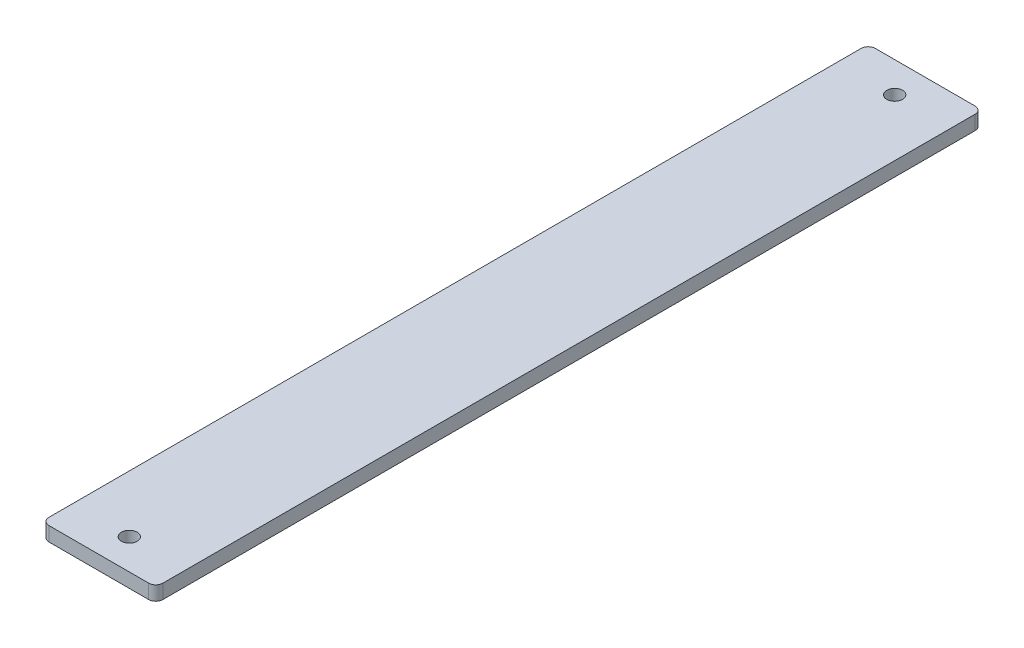
ISO-10303-21;
HEADER;
FILE_DESCRIPTION(('STEP AP214'),'2;1');
FILE_NAME('part.step','',(''),(''),'','','');
FILE_SCHEMA(('AUTOMOTIVE_DESIGN { 1 0 10303 214 1 1 1 1 }'));
ENDSEC;
DATA;
#1=APPLICATION_CONTEXT('core data for automotive mechanical design processes');
#2=APPLICATION_PROTOCOL_DEFINITION('international standard','automotive_design',2000,#1);
#3=PRODUCT_CONTEXT('',#1,'mechanical');
#4=PRODUCT('Part','Part','',(#3));
#5=PRODUCT_RELATED_PRODUCT_CATEGORY('part','',(#4));
#6=PRODUCT_DEFINITION_FORMATION('','',#4);
#7=PRODUCT_DEFINITION_CONTEXT('part definition',#1,'design');
#8=PRODUCT_DEFINITION('design','',#6,#7);
#9=PRODUCT_DEFINITION_SHAPE('','',#8);
#10=(LENGTH_UNIT() NAMED_UNIT(*) SI_UNIT(.MILLI.,.METRE.));
#11=(NAMED_UNIT(*) PLANE_ANGLE_UNIT() SI_UNIT($,.RADIAN.));
#12=(NAMED_UNIT(*) SI_UNIT($,.STERADIAN.) SOLID_ANGLE_UNIT());
#13=UNCERTAINTY_MEASURE_WITH_UNIT(LENGTH_MEASURE(1.E-05),#10,'distance_accuracy_value','');
#14=(GEOMETRIC_REPRESENTATION_CONTEXT(3) GLOBAL_UNCERTAINTY_ASSIGNED_CONTEXT((#13)) GLOBAL_UNIT_ASSIGNED_CONTEXT((#10,
#11,#12)) REPRESENTATION_CONTEXT('',''));
#15=CARTESIAN_POINT('',(0.,0.,0.));
#16=DIRECTION('',(0.,0.,1.));
#17=DIRECTION('',(1.,0.,0.));
#18=AXIS2_PLACEMENT_3D('',#15,#16,#17);
#19=CARTESIAN_POINT('',(241.3,0.,723.9));
#20=DIRECTION('',(0.,-1.,0.));
#21=DIRECTION('',(0.,0.,-1.));
#22=AXIS2_PLACEMENT_3D('',#19,#20,#21);
#23=PLANE('',#22);
#24=DIRECTION('',(-1.,0.,0.));
#25=VECTOR('',#24,1.);
#26=CARTESIAN_POINT('',(241.3,0.,736.6));
#27=LINE('',#26,#25);
#28=CARTESIAN_POINT('',(241.3,0.,736.6));
#29=VERTEX_POINT('',#28);
#30=CARTESIAN_POINT('',(419.1,0.,736.6));
#31=VERTEX_POINT('',#30);
#32=EDGE_CURVE('E83',#29,#31,#27,.F.);
#33=ORIENTED_EDGE('',*,*,#32,.T.);
#34=CARTESIAN_POINT('',(419.1,0.,723.9));
#35=DIRECTION('',(0.,1.,0.));
#36=DIRECTION('',(0.,0.,1.));
#37=AXIS2_PLACEMENT_3D('',#34,#35,#36);
#38=CIRCLE('',#37,12.7000000000002);
#39=CARTESIAN_POINT('',(431.8,0.,723.9));
#40=VERTEX_POINT('',#39);
#41=EDGE_CURVE('E110',#40,#31,#38,.F.);
#42=ORIENTED_EDGE('',*,*,#41,.F.);
#43=DIRECTION('',(0.,0.,1.));
#44=VECTOR('',#43,1.);
#45=CARTESIAN_POINT('',(431.8,0.,723.9));
#46=LINE('',#45,#44);
#47=CARTESIAN_POINT('',(431.8,0.,-723.9));
#48=VERTEX_POINT('',#47);
#49=EDGE_CURVE('E107',#40,#48,#46,.F.);
#50=ORIENTED_EDGE('',*,*,#49,.T.);
#51=CARTESIAN_POINT('',(419.1,0.,-723.9));
#52=DIRECTION('',(0.,1.,0.));
#53=DIRECTION('',(0.,0.,1.));
#54=AXIS2_PLACEMENT_3D('',#51,#52,#53);
#55=CIRCLE('',#54,12.7000000000002);
#56=CARTESIAN_POINT('',(419.1,0.,-736.6));
#57=VERTEX_POINT('',#56);
#58=EDGE_CURVE('E115',#57,#48,#55,.F.);
#59=ORIENTED_EDGE('',*,*,#58,.F.);
#60=DIRECTION('',(1.,0.,0.));
#61=VECTOR('',#60,1.);
#62=CARTESIAN_POINT('',(241.3,0.,-736.6));
#63=LINE('',#62,#61);
#64=CARTESIAN_POINT('',(241.3,0.,-736.6));
#65=VERTEX_POINT('',#64);
#66=EDGE_CURVE('E112',#57,#65,#63,.F.);
#67=ORIENTED_EDGE('',*,*,#66,.T.);
#68=CARTESIAN_POINT('',(241.3,0.,-723.9));
#69=DIRECTION('',(0.,1.,0.));
#70=DIRECTION('',(0.,0.,1.));
#71=AXIS2_PLACEMENT_3D('',#68,#69,#70);
#72=CIRCLE('',#71,12.7);
#73=CARTESIAN_POINT('',(228.6,0.,-723.9));
#74=VERTEX_POINT('',#73);
#75=EDGE_CURVE('E118',#74,#65,#72,.F.);
#76=ORIENTED_EDGE('',*,*,#75,.F.);
#77=DIRECTION('',(0.,0.,-1.));
#78=VECTOR('',#77,1.);
#79=CARTESIAN_POINT('',(228.6,0.,723.9));
#80=LINE('',#79,#78);
#81=CARTESIAN_POINT('',(228.6,0.,723.9));
#82=VERTEX_POINT('',#81);
#83=EDGE_CURVE('E85',#74,#82,#80,.F.);
#84=ORIENTED_EDGE('',*,*,#83,.T.);
#85=CARTESIAN_POINT('',(241.3,0.,723.9));
#86=DIRECTION('',(0.,1.,0.));
#87=DIRECTION('',(0.,0.,1.));
#88=AXIS2_PLACEMENT_3D('',#85,#86,#87);
#89=CIRCLE('',#88,12.7);
#90=EDGE_CURVE('E79',#29,#82,#89,.F.);
#91=ORIENTED_EDGE('',*,*,#90,.F.);
#92=EDGE_LOOP('',(#33,#42,#50,#59,#67,#76,#84,#91));
#93=FACE_BOUND('',#92,.T.);
#94=CARTESIAN_POINT('',(330.2,0.,-682.211067355815));
#95=DIRECTION('',(0.,-1.,0.));
#96=DIRECTION('',(0.,0.,-1.));
#97=AXIS2_PLACEMENT_3D('',#94,#95,#96);
#98=CIRCLE('',#97,14.0893799999999);
#99=CARTESIAN_POINT('',(330.2,0.,-696.300447355815));
#100=VERTEX_POINT('',#99);
#101=EDGE_CURVE('E89',#100,#100,#98,.T.);
#102=ORIENTED_EDGE('',*,*,#101,.T.);
#103=EDGE_LOOP('',(#102));
#104=FACE_BOUND('',#103,.T.);
#105=CARTESIAN_POINT('',(330.2,0.,682.211067355815));
#106=DIRECTION('',(0.,-1.,0.));
#107=DIRECTION('',(0.,0.,-1.));
#108=AXIS2_PLACEMENT_3D('',#105,#106,#107);
#109=CIRCLE('',#108,14.0893799999999);
#110=CARTESIAN_POINT('',(330.2,0.,668.121687355815));
#111=VERTEX_POINT('',#110);
#112=EDGE_CURVE('E19',#111,#111,#109,.T.);
#113=ORIENTED_EDGE('',*,*,#112,.T.);
#114=EDGE_LOOP('',(#113));
#115=FACE_BOUND('',#114,.T.);
#116=ADVANCED_FACE('F16',(#93,#104,#115),#23,.F.);
#117=CARTESIAN_POINT('',(330.2,-25.4,682.211067355815));
#118=DIRECTION('',(0.,-1.,0.));
#119=DIRECTION('',(0.,0.,-1.));
#120=AXIS2_PLACEMENT_3D('',#117,#118,#119);
#121=CYLINDRICAL_SURFACE('',#120,14.0893799999999);
#122=CARTESIAN_POINT('',(330.2,-25.4,682.211067355815));
#123=DIRECTION('',(0.,-1.,0.));
#124=DIRECTION('',(0.,0.,-1.));
#125=AXIS2_PLACEMENT_3D('',#122,#123,#124);
#126=CIRCLE('',#125,14.0893799999999);
#127=CARTESIAN_POINT('',(330.2,-25.4,668.121687355815));
#128=VERTEX_POINT('',#127);
#129=EDGE_CURVE('E99',#128,#128,#126,.F.);
#130=ORIENTED_EDGE('',*,*,#129,.F.);
#131=EDGE_LOOP('',(#130));
#132=FACE_BOUND('',#131,.T.);
#133=ORIENTED_EDGE('',*,*,#112,.F.);
#134=EDGE_LOOP('',(#133));
#135=FACE_BOUND('',#134,.T.);
#136=ADVANCED_FACE('F144',(#132,#135),#121,.F.);
#137=CARTESIAN_POINT('',(330.2,-25.4,-682.211067355815));
#138=DIRECTION('',(0.,-1.,0.));
#139=DIRECTION('',(0.,0.,-1.));
#140=AXIS2_PLACEMENT_3D('',#137,#138,#139);
#141=CYLINDRICAL_SURFACE('',#140,14.0893799999999);
#142=CARTESIAN_POINT('',(330.2,-25.4,-682.211067355815));
#143=DIRECTION('',(0.,-1.,0.));
#144=DIRECTION('',(0.,0.,-1.));
#145=AXIS2_PLACEMENT_3D('',#142,#143,#144);
#146=CIRCLE('',#145,14.0893799999999);
#147=CARTESIAN_POINT('',(330.2,-25.4,-696.300447355815));
#148=VERTEX_POINT('',#147);
#149=EDGE_CURVE('E102',#148,#148,#146,.F.);
#150=ORIENTED_EDGE('',*,*,#149,.F.);
#151=EDGE_LOOP('',(#150));
#152=FACE_BOUND('',#151,.T.);
#153=ORIENTED_EDGE('',*,*,#101,.F.);
#154=EDGE_LOOP('',(#153));
#155=FACE_BOUND('',#154,.T.);
#156=ADVANCED_FACE('F146',(#152,#155),#141,.F.);
#157=CARTESIAN_POINT('',(241.3,-25.4,723.9));
#158=DIRECTION('',(0.,1.,0.));
#159=DIRECTION('',(0.,0.,1.));
#160=AXIS2_PLACEMENT_3D('',#157,#158,#159);
#161=CYLINDRICAL_SURFACE('',#160,12.7);
#162=CARTESIAN_POINT('',(241.3,-25.4,723.9));
#163=DIRECTION('',(0.,1.,0.));
#164=DIRECTION('',(0.,0.,1.));
#165=AXIS2_PLACEMENT_3D('',#162,#163,#164);
#166=CIRCLE('',#165,12.7);
#167=CARTESIAN_POINT('',(241.3,-25.4,736.6));
#168=VERTEX_POINT('',#167);
#169=CARTESIAN_POINT('',(228.6,-25.4,723.9));
#170=VERTEX_POINT('',#169);
#171=EDGE_CURVE('E95',#168,#170,#166,.F.);
#172=ORIENTED_EDGE('',*,*,#171,.F.);
#173=DIRECTION('',(0.,1.,0.));
#174=VECTOR('',#173,1.);
#175=CARTESIAN_POINT('',(241.3,-25.4,736.6));
#176=LINE('',#175,#174);
#177=EDGE_CURVE('E92',#168,#29,#176,.T.);
#178=ORIENTED_EDGE('',*,*,#177,.T.);
#179=ORIENTED_EDGE('',*,*,#90,.T.);
#180=DIRECTION('',(0.,1.,0.));
#181=VECTOR('',#180,1.);
#182=CARTESIAN_POINT('',(228.6,-25.4,723.9));
#183=LINE('',#182,#181);
#184=EDGE_CURVE('E88',#82,#170,#183,.F.);
#185=ORIENTED_EDGE('',*,*,#184,.T.);
#186=EDGE_LOOP('',(#172,#178,#179,#185));
#187=FACE_BOUND('',#186,.T.);
#188=ADVANCED_FACE('F93',(#187),#161,.T.);
#189=CARTESIAN_POINT('',(228.6,-25.4,723.9));
#190=DIRECTION('',(1.,0.,0.));
#191=DIRECTION('',(0.,0.,-1.));
#192=AXIS2_PLACEMENT_3D('',#189,#190,#191);
#193=PLANE('',#192);
#194=DIRECTION('',(0.,1.,0.));
#195=VECTOR('',#194,1.);
#196=CARTESIAN_POINT('',(228.6,-25.4,-723.9));
#197=LINE('',#196,#195);
#198=CARTESIAN_POINT('',(228.6,-25.4,-723.9));
#199=VERTEX_POINT('',#198);
#200=EDGE_CURVE('E137',#199,#74,#197,.T.);
#201=ORIENTED_EDGE('',*,*,#200,.F.);
#202=DIRECTION('',(0.,0.,-1.));
#203=VECTOR('',#202,1.);
#204=CARTESIAN_POINT('',(228.6,-25.4,723.9));
#205=LINE('',#204,#203);
#206=EDGE_CURVE('E129',#170,#199,#205,.T.);
#207=ORIENTED_EDGE('',*,*,#206,.F.);
#208=ORIENTED_EDGE('',*,*,#184,.F.);
#209=ORIENTED_EDGE('',*,*,#83,.F.);
#210=EDGE_LOOP('',(#201,#207,#208,#209));
#211=FACE_BOUND('',#210,.T.);
#212=ADVANCED_FACE('F184',(#211),#193,.F.);
#213=CARTESIAN_POINT('',(241.3,-25.4,-723.9));
#214=DIRECTION('',(0.,1.,0.));
#215=DIRECTION('',(0.,0.,1.));
#216=AXIS2_PLACEMENT_3D('',#213,#214,#215);
#217=CYLINDRICAL_SURFACE('',#216,12.7);
#218=CARTESIAN_POINT('',(241.3,-25.4,-723.9));
#219=DIRECTION('',(0.,1.,0.));
#220=DIRECTION('',(0.,0.,1.));
#221=AXIS2_PLACEMENT_3D('',#218,#219,#220);
#222=CIRCLE('',#221,12.7);
#223=CARTESIAN_POINT('',(241.3,-25.4,-736.6));
#224=VERTEX_POINT('',#223);
#225=EDGE_CURVE('E126',#199,#224,#222,.F.);
#226=ORIENTED_EDGE('',*,*,#225,.F.);
#227=ORIENTED_EDGE('',*,*,#200,.T.);
#228=ORIENTED_EDGE('',*,*,#75,.T.);
#229=DIRECTION('',(0.,1.,0.));
#230=VECTOR('',#229,1.);
#231=CARTESIAN_POINT('',(241.3,-25.4,-736.6));
#232=LINE('',#231,#230);
#233=EDGE_CURVE('E116',#65,#224,#232,.F.);
#234=ORIENTED_EDGE('',*,*,#233,.T.);
#235=EDGE_LOOP('',(#226,#227,#228,#234));
#236=FACE_BOUND('',#235,.T.);
#237=ADVANCED_FACE('F180',(#236),#217,.T.);
#238=CARTESIAN_POINT('',(241.3,-25.4,-736.6));
#239=DIRECTION('',(0.,0.,1.));
#240=DIRECTION('',(1.,0.,0.));
#241=AXIS2_PLACEMENT_3D('',#238,#239,#240);
#242=PLANE('',#241);
#243=DIRECTION('',(0.,1.,0.));
#244=VECTOR('',#243,1.);
#245=CARTESIAN_POINT('',(419.1,-25.4,-736.6));
#246=LINE('',#245,#244);
#247=CARTESIAN_POINT('',(419.1,-25.4,-736.6));
#248=VERTEX_POINT('',#247);
#249=EDGE_CURVE('E136',#248,#57,#246,.T.);
#250=ORIENTED_EDGE('',*,*,#249,.F.);
#251=DIRECTION('',(1.,0.,0.));
#252=VECTOR('',#251,1.);
#253=CARTESIAN_POINT('',(241.3,-25.4,-736.6));
#254=LINE('',#253,#252);
#255=EDGE_CURVE('E125',#224,#248,#254,.T.);
#256=ORIENTED_EDGE('',*,*,#255,.F.);
#257=ORIENTED_EDGE('',*,*,#233,.F.);
#258=ORIENTED_EDGE('',*,*,#66,.F.);
#259=EDGE_LOOP('',(#250,#256,#257,#258));
#260=FACE_BOUND('',#259,.T.);
#261=ADVANCED_FACE('F176',(#260),#242,.F.);
#262=CARTESIAN_POINT('',(419.1,-25.4,-723.9));
#263=DIRECTION('',(0.,1.,0.));
#264=DIRECTION('',(0.,0.,1.));
#265=AXIS2_PLACEMENT_3D('',#262,#263,#264);
#266=CYLINDRICAL_SURFACE('',#265,12.7000000000002);
#267=CARTESIAN_POINT('',(419.1,-25.4,-723.9));
#268=DIRECTION('',(0.,1.,0.));
#269=DIRECTION('',(0.,0.,1.));
#270=AXIS2_PLACEMENT_3D('',#267,#268,#269);
#271=CIRCLE('',#270,12.7000000000002);
#272=CARTESIAN_POINT('',(431.8,-25.4,-723.9));
#273=VERTEX_POINT('',#272);
#274=EDGE_CURVE('E122',#248,#273,#271,.F.);
#275=ORIENTED_EDGE('',*,*,#274,.F.);
#276=ORIENTED_EDGE('',*,*,#249,.T.);
#277=ORIENTED_EDGE('',*,*,#58,.T.);
#278=DIRECTION('',(0.,1.,0.));
#279=VECTOR('',#278,1.);
#280=CARTESIAN_POINT('',(431.8,-25.4,-723.9));
#281=LINE('',#280,#279);
#282=EDGE_CURVE('E111',#48,#273,#281,.F.);
#283=ORIENTED_EDGE('',*,*,#282,.T.);
#284=EDGE_LOOP('',(#275,#276,#277,#283));
#285=FACE_BOUND('',#284,.T.);
#286=ADVANCED_FACE('F172',(#285),#266,.T.);
#287=CARTESIAN_POINT('',(431.8,-25.4,723.9));
#288=DIRECTION('',(-1.,0.,0.));
#289=DIRECTION('',(0.,0.,1.));
#290=AXIS2_PLACEMENT_3D('',#287,#288,#289);
#291=PLANE('',#290);
#292=DIRECTION('',(0.,1.,0.));
#293=VECTOR('',#292,1.);
#294=CARTESIAN_POINT('',(431.8,-25.4,723.9));
#295=LINE('',#294,#293);
#296=CARTESIAN_POINT('',(431.8,-25.4,723.9));
#297=VERTEX_POINT('',#296);
#298=EDGE_CURVE('E134',#297,#40,#295,.T.);
#299=ORIENTED_EDGE('',*,*,#298,.F.);
#300=DIRECTION('',(0.,0.,-1.));
#301=VECTOR('',#300,1.);
#302=CARTESIAN_POINT('',(431.8,-25.4,723.9));
#303=LINE('',#302,#301);
#304=EDGE_CURVE('E121',#273,#297,#303,.F.);
#305=ORIENTED_EDGE('',*,*,#304,.F.);
#306=ORIENTED_EDGE('',*,*,#282,.F.);
#307=ORIENTED_EDGE('',*,*,#49,.F.);
#308=EDGE_LOOP('',(#299,#305,#306,#307));
#309=FACE_BOUND('',#308,.T.);
#310=ADVANCED_FACE('F169',(#309),#291,.F.);
#311=CARTESIAN_POINT('',(419.1,-25.4,723.9));
#312=DIRECTION('',(0.,1.,0.));
#313=DIRECTION('',(0.,0.,1.));
#314=AXIS2_PLACEMENT_3D('',#311,#312,#313);
#315=CYLINDRICAL_SURFACE('',#314,12.7000000000002);
#316=CARTESIAN_POINT('',(419.1,-25.4,723.9));
#317=DIRECTION('',(0.,1.,0.));
#318=DIRECTION('',(0.,0.,1.));
#319=AXIS2_PLACEMENT_3D('',#316,#317,#318);
#320=CIRCLE('',#319,12.7000000000002);
#321=CARTESIAN_POINT('',(419.1,-25.4,736.6));
#322=VERTEX_POINT('',#321);
#323=EDGE_CURVE('E25',#297,#322,#320,.F.);
#324=ORIENTED_EDGE('',*,*,#323,.F.);
#325=ORIENTED_EDGE('',*,*,#298,.T.);
#326=ORIENTED_EDGE('',*,*,#41,.T.);
#327=DIRECTION('',(0.,1.,0.));
#328=VECTOR('',#327,1.);
#329=CARTESIAN_POINT('',(419.1,-25.4,736.6));
#330=LINE('',#329,#328);
#331=EDGE_CURVE('E34',#31,#322,#330,.F.);
#332=ORIENTED_EDGE('',*,*,#331,.T.);
#333=EDGE_LOOP('',(#324,#325,#326,#332));
#334=FACE_BOUND('',#333,.T.);
#335=ADVANCED_FACE('F163',(#334),#315,.T.);
#336=CARTESIAN_POINT('',(241.3,-25.4,736.6));
#337=DIRECTION('',(0.,0.,-1.));
#338=DIRECTION('',(-1.,0.,0.));
#339=AXIS2_PLACEMENT_3D('',#336,#337,#338);
#340=PLANE('',#339);
#341=ORIENTED_EDGE('',*,*,#177,.F.);
#342=DIRECTION('',(1.,0.,0.));
#343=VECTOR('',#342,1.);
#344=CARTESIAN_POINT('',(241.3,-25.4,736.6));
#345=LINE('',#344,#343);
#346=EDGE_CURVE('E11',#322,#168,#345,.F.);
#347=ORIENTED_EDGE('',*,*,#346,.F.);
#348=ORIENTED_EDGE('',*,*,#331,.F.);
#349=ORIENTED_EDGE('',*,*,#32,.F.);
#350=EDGE_LOOP('',(#341,#347,#348,#349));
#351=FACE_BOUND('',#350,.T.);
#352=ADVANCED_FACE('F98',(#351),#340,.F.);
#353=CARTESIAN_POINT('',(241.3,-25.4,723.9));
#354=DIRECTION('',(0.,-1.,0.));
#355=DIRECTION('',(0.,0.,-1.));
#356=AXIS2_PLACEMENT_3D('',#353,#354,#355);
#357=PLANE('',#356);
#358=ORIENTED_EDGE('',*,*,#323,.T.);
#359=ORIENTED_EDGE('',*,*,#346,.T.);
#360=ORIENTED_EDGE('',*,*,#171,.T.);
#361=ORIENTED_EDGE('',*,*,#206,.T.);
#362=ORIENTED_EDGE('',*,*,#225,.T.);
#363=ORIENTED_EDGE('',*,*,#255,.T.);
#364=ORIENTED_EDGE('',*,*,#274,.T.);
#365=ORIENTED_EDGE('',*,*,#304,.T.);
#366=EDGE_LOOP('',(#358,#359,#360,#361,#362,#363,#364,#365));
#367=FACE_BOUND('',#366,.T.);
#368=ORIENTED_EDGE('',*,*,#149,.T.);
#369=EDGE_LOOP('',(#368));
#370=FACE_BOUND('',#369,.T.);
#371=ORIENTED_EDGE('',*,*,#129,.T.);
#372=EDGE_LOOP('',(#371));
#373=FACE_BOUND('',#372,.T.);
#374=ADVANCED_FACE('F156',(#367,#370,#373),#357,.T.);
#375=CLOSED_SHELL('',(#116,#136,#156,#188,#212,#237,#261,#286,#310,#335,#352,#374));
#376=MANIFOLD_SOLID_BREP('B1',#375);
#377=ADVANCED_BREP_SHAPE_REPRESENTATION('',(#18,#376),#14);
#378=SHAPE_DEFINITION_REPRESENTATION(#9,#377);
ENDSEC;
END-ISO-10303-21;
